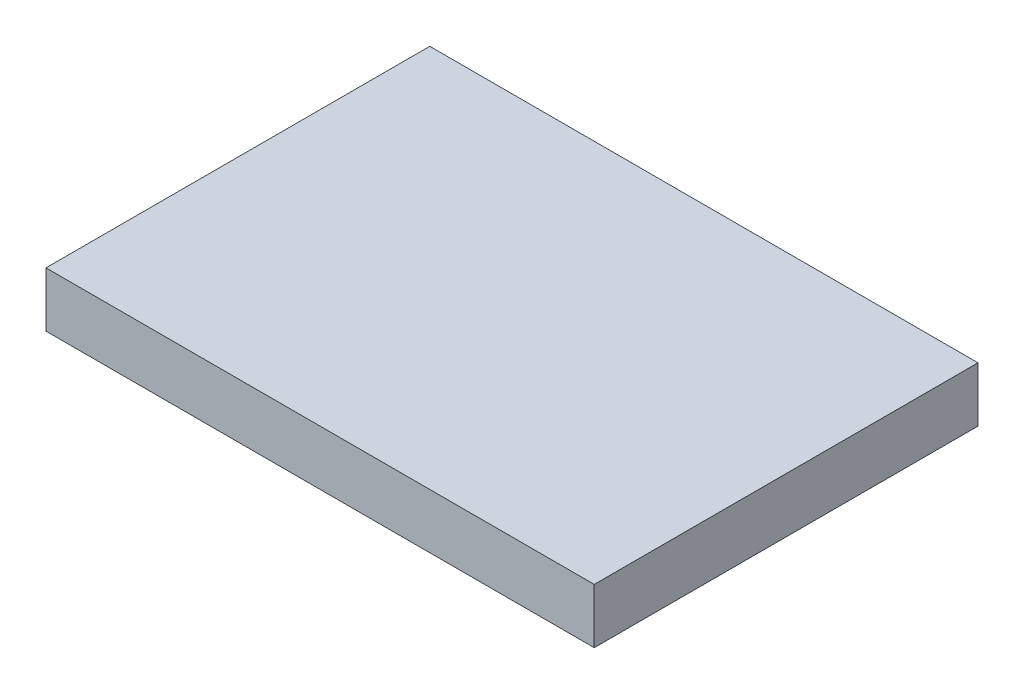
ISO-10303-21;
HEADER;
FILE_DESCRIPTION(('STEP AP214'),'2;1');
FILE_NAME('part.step','',(''),(''),'','','');
FILE_SCHEMA(('AUTOMOTIVE_DESIGN { 1 0 10303 214 1 1 1 1 }'));
ENDSEC;
DATA;
#1=APPLICATION_CONTEXT('core data for automotive mechanical design processes');
#2=APPLICATION_PROTOCOL_DEFINITION('international standard','automotive_design',2000,#1);
#3=PRODUCT_CONTEXT('',#1,'mechanical');
#4=PRODUCT('Part','Part','',(#3));
#5=PRODUCT_RELATED_PRODUCT_CATEGORY('part','',(#4));
#6=PRODUCT_DEFINITION_FORMATION('','',#4);
#7=PRODUCT_DEFINITION_CONTEXT('part definition',#1,'design');
#8=PRODUCT_DEFINITION('design','',#6,#7);
#9=PRODUCT_DEFINITION_SHAPE('','',#8);
#10=(LENGTH_UNIT() NAMED_UNIT(*) SI_UNIT(.MILLI.,.METRE.));
#11=(NAMED_UNIT(*) PLANE_ANGLE_UNIT() SI_UNIT($,.RADIAN.));
#12=(NAMED_UNIT(*) SI_UNIT($,.STERADIAN.) SOLID_ANGLE_UNIT());
#13=UNCERTAINTY_MEASURE_WITH_UNIT(LENGTH_MEASURE(1.E-05),#10,'distance_accuracy_value','');
#14=(GEOMETRIC_REPRESENTATION_CONTEXT(3) GLOBAL_UNCERTAINTY_ASSIGNED_CONTEXT((#13)) GLOBAL_UNIT_ASSIGNED_CONTEXT((#10,
#11,#12)) REPRESENTATION_CONTEXT('',''));
#15=CARTESIAN_POINT('',(0.,0.,0.));
#16=DIRECTION('',(0.,0.,1.));
#17=DIRECTION('',(1.,0.,0.));
#18=AXIS2_PLACEMENT_3D('',#15,#16,#17);
#19=CARTESIAN_POINT('',(100.,20.,70.));
#20=DIRECTION('',(-1.,0.,0.));
#21=DIRECTION('',(0.,0.,1.));
#22=AXIS2_PLACEMENT_3D('',#19,#20,#21);
#23=PLANE('',#22);
#24=DIRECTION('',(0.,0.,-1.));
#25=VECTOR('',#24,1.);
#26=CARTESIAN_POINT('',(100.,0.,70.));
#27=LINE('',#26,#25);
#28=CARTESIAN_POINT('',(100.,0.,70.));
#29=VERTEX_POINT('',#28);
#30=CARTESIAN_POINT('',(100.,0.,-70.0000000000002));
#31=VERTEX_POINT('',#30);
#32=EDGE_CURVE('E102',#29,#31,#27,.T.);
#33=ORIENTED_EDGE('',*,*,#32,.T.);
#34=DIRECTION('',(0.,-1.,0.));
#35=VECTOR('',#34,1.);
#36=CARTESIAN_POINT('',(100.,20.,-70.0000000000002));
#37=LINE('',#36,#35);
#38=CARTESIAN_POINT('',(100.,20.,-70.0000000000002));
#39=VERTEX_POINT('',#38);
#40=EDGE_CURVE('E11',#39,#31,#37,.T.);
#41=ORIENTED_EDGE('',*,*,#40,.F.);
#42=DIRECTION('',(0.,0.,-1.));
#43=VECTOR('',#42,1.);
#44=CARTESIAN_POINT('',(100.,20.,70.));
#45=LINE('',#44,#43);
#46=CARTESIAN_POINT('',(100.,20.,70.));
#47=VERTEX_POINT('',#46);
#48=EDGE_CURVE('E90',#47,#39,#45,.T.);
#49=ORIENTED_EDGE('',*,*,#48,.F.);
#50=DIRECTION('',(0.,-1.,0.));
#51=VECTOR('',#50,1.);
#52=CARTESIAN_POINT('',(100.,20.,70.));
#53=LINE('',#52,#51);
#54=EDGE_CURVE('E98',#47,#29,#53,.T.);
#55=ORIENTED_EDGE('',*,*,#54,.T.);
#56=EDGE_LOOP('',(#33,#41,#49,#55));
#57=FACE_BOUND('',#56,.T.);
#58=ADVANCED_FACE('F39',(#57),#23,.F.);
#59=CARTESIAN_POINT('',(-99.9999999999998,20.,-70.0000000000002));
#60=DIRECTION('',(0.,0.,1.));
#61=DIRECTION('',(1.,0.,0.));
#62=AXIS2_PLACEMENT_3D('',#59,#60,#61);
#63=PLANE('',#62);
#64=DIRECTION('',(-1.,0.,0.));
#65=VECTOR('',#64,1.);
#66=CARTESIAN_POINT('',(-99.9999999999998,0.,-70.0000000000002));
#67=LINE('',#66,#65);
#68=CARTESIAN_POINT('',(-99.9999999999998,0.,-70.0000000000002));
#69=VERTEX_POINT('',#68);
#70=EDGE_CURVE('E94',#31,#69,#67,.T.);
#71=ORIENTED_EDGE('',*,*,#70,.T.);
#72=DIRECTION('',(0.,-1.,0.));
#73=VECTOR('',#72,1.);
#74=CARTESIAN_POINT('',(-99.9999999999998,20.,-70.0000000000002));
#75=LINE('',#74,#73);
#76=CARTESIAN_POINT('',(-99.9999999999998,20.,-70.0000000000002));
#77=VERTEX_POINT('',#76);
#78=EDGE_CURVE('E47',#77,#69,#75,.T.);
#79=ORIENTED_EDGE('',*,*,#78,.F.);
#80=DIRECTION('',(-1.,0.,0.));
#81=VECTOR('',#80,1.);
#82=CARTESIAN_POINT('',(-99.9999999999998,20.,-70.0000000000002));
#83=LINE('',#82,#81);
#84=EDGE_CURVE('E85',#39,#77,#83,.T.);
#85=ORIENTED_EDGE('',*,*,#84,.F.);
#86=ORIENTED_EDGE('',*,*,#40,.T.);
#87=EDGE_LOOP('',(#71,#79,#85,#86));
#88=FACE_BOUND('',#87,.T.);
#89=ADVANCED_FACE('F93',(#88),#63,.F.);
#90=CARTESIAN_POINT('',(-99.9999999999998,20.,70.));
#91=DIRECTION('',(1.,0.,0.));
#92=DIRECTION('',(0.,0.,-1.));
#93=AXIS2_PLACEMENT_3D('',#90,#91,#92);
#94=PLANE('',#93);
#95=DIRECTION('',(0.,0.,1.));
#96=VECTOR('',#95,1.);
#97=CARTESIAN_POINT('',(-99.9999999999998,0.,70.));
#98=LINE('',#97,#96);
#99=CARTESIAN_POINT('',(-99.9999999999998,0.,70.));
#100=VERTEX_POINT('',#99);
#101=EDGE_CURVE('E72',#69,#100,#98,.T.);
#102=ORIENTED_EDGE('',*,*,#101,.T.);
#103=DIRECTION('',(0.,-1.,0.));
#104=VECTOR('',#103,1.);
#105=CARTESIAN_POINT('',(-99.9999999999998,20.,70.));
#106=LINE('',#105,#104);
#107=CARTESIAN_POINT('',(-99.9999999999998,20.,70.));
#108=VERTEX_POINT('',#107);
#109=EDGE_CURVE('E95',#108,#100,#106,.T.);
#110=ORIENTED_EDGE('',*,*,#109,.F.);
#111=DIRECTION('',(0.,0.,1.));
#112=VECTOR('',#111,1.);
#113=CARTESIAN_POINT('',(-99.9999999999998,20.,70.));
#114=LINE('',#113,#112);
#115=EDGE_CURVE('E88',#77,#108,#114,.T.);
#116=ORIENTED_EDGE('',*,*,#115,.F.);
#117=ORIENTED_EDGE('',*,*,#78,.T.);
#118=EDGE_LOOP('',(#102,#110,#116,#117));
#119=FACE_BOUND('',#118,.T.);
#120=ADVANCED_FACE('F96',(#119),#94,.F.);
#121=CARTESIAN_POINT('',(-99.9999999999998,20.,70.));
#122=DIRECTION('',(0.,0.,-1.));
#123=DIRECTION('',(-1.,0.,0.));
#124=AXIS2_PLACEMENT_3D('',#121,#122,#123);
#125=PLANE('',#124);
#126=DIRECTION('',(1.,0.,0.));
#127=VECTOR('',#126,1.);
#128=CARTESIAN_POINT('',(-99.9999999999998,0.,70.));
#129=LINE('',#128,#127);
#130=EDGE_CURVE('E78',#100,#29,#129,.T.);
#131=ORIENTED_EDGE('',*,*,#130,.T.);
#132=ORIENTED_EDGE('',*,*,#54,.F.);
#133=DIRECTION('',(1.,0.,0.));
#134=VECTOR('',#133,1.);
#135=CARTESIAN_POINT('',(-99.9999999999998,20.,70.));
#136=LINE('',#135,#134);
#137=EDGE_CURVE('E55',#108,#47,#136,.T.);
#138=ORIENTED_EDGE('',*,*,#137,.F.);
#139=ORIENTED_EDGE('',*,*,#109,.T.);
#140=EDGE_LOOP('',(#131,#132,#138,#139));
#141=FACE_BOUND('',#140,.T.);
#142=ADVANCED_FACE('F109',(#141),#125,.F.);
#143=CARTESIAN_POINT('',(0.,20.,0.));
#144=DIRECTION('',(0.,-1.,0.));
#145=DIRECTION('',(0.,0.,-1.));
#146=AXIS2_PLACEMENT_3D('',#143,#144,#145);
#147=PLANE('',#146);
#148=ORIENTED_EDGE('',*,*,#48,.T.);
#149=ORIENTED_EDGE('',*,*,#84,.T.);
#150=ORIENTED_EDGE('',*,*,#115,.T.);
#151=ORIENTED_EDGE('',*,*,#137,.T.);
#152=EDGE_LOOP('',(#148,#149,#150,#151));
#153=FACE_BOUND('',#152,.T.);
#154=ADVANCED_FACE('F86',(#153),#147,.F.);
#155=CARTESIAN_POINT('',(0.,0.,0.));
#156=DIRECTION('',(0.,-1.,0.));
#157=DIRECTION('',(0.,0.,-1.));
#158=AXIS2_PLACEMENT_3D('',#155,#156,#157);
#159=PLANE('',#158);
#160=ORIENTED_EDGE('',*,*,#32,.F.);
#161=ORIENTED_EDGE('',*,*,#130,.F.);
#162=ORIENTED_EDGE('',*,*,#101,.F.);
#163=ORIENTED_EDGE('',*,*,#70,.F.);
#164=EDGE_LOOP('',(#160,#161,#162,#163));
#165=FACE_BOUND('',#164,.T.);
#166=ADVANCED_FACE('F112',(#165),#159,.T.);
#167=CLOSED_SHELL('',(#58,#89,#120,#142,#154,#166));
#168=MANIFOLD_SOLID_BREP('B2',#167);
#169=ADVANCED_BREP_SHAPE_REPRESENTATION('',(#18,#168),#14);
#170=SHAPE_DEFINITION_REPRESENTATION(#9,#169);
ENDSEC;
END-ISO-10303-21;
